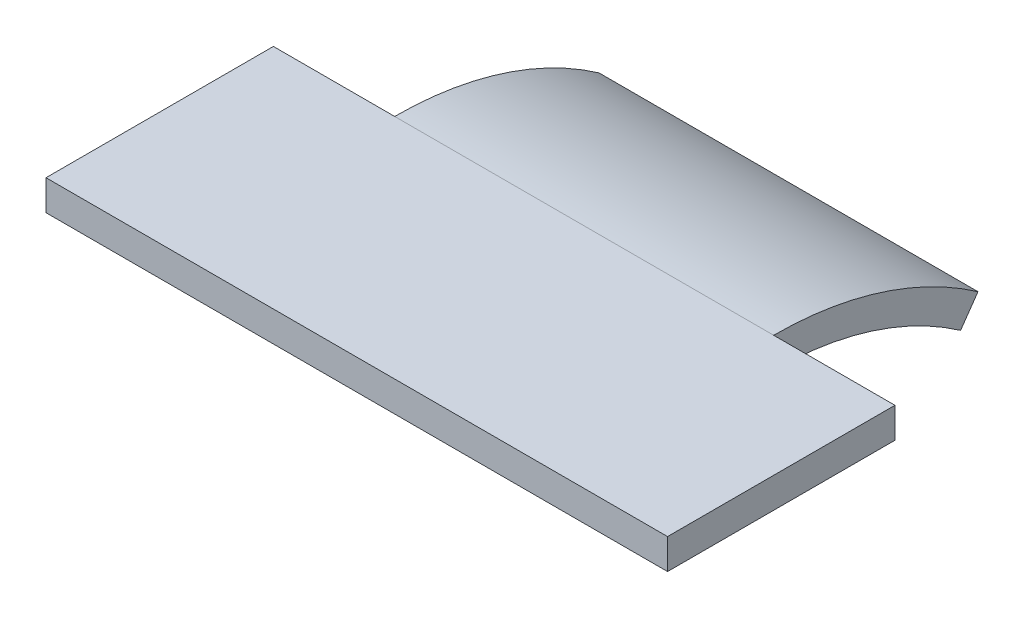
ISO-10303-21;
HEADER;
FILE_DESCRIPTION(('STEP AP214'),'2;1');
FILE_NAME('part.step','',(''),(''),'','','');
FILE_SCHEMA(('AUTOMOTIVE_DESIGN { 1 0 10303 214 1 1 1 1 }'));
ENDSEC;
DATA;
#1=APPLICATION_CONTEXT('core data for automotive mechanical design processes');
#2=APPLICATION_PROTOCOL_DEFINITION('international standard','automotive_design',2000,#1);
#3=PRODUCT_CONTEXT('',#1,'mechanical');
#4=PRODUCT('Part','Part','',(#3));
#5=PRODUCT_RELATED_PRODUCT_CATEGORY('part','',(#4));
#6=PRODUCT_DEFINITION_FORMATION('','',#4);
#7=PRODUCT_DEFINITION_CONTEXT('part definition',#1,'design');
#8=PRODUCT_DEFINITION('design','',#6,#7);
#9=PRODUCT_DEFINITION_SHAPE('','',#8);
#10=(LENGTH_UNIT() NAMED_UNIT(*) SI_UNIT(.MILLI.,.METRE.));
#11=(NAMED_UNIT(*) PLANE_ANGLE_UNIT() SI_UNIT($,.RADIAN.));
#12=(NAMED_UNIT(*) SI_UNIT($,.STERADIAN.) SOLID_ANGLE_UNIT());
#13=UNCERTAINTY_MEASURE_WITH_UNIT(LENGTH_MEASURE(1.E-05),#10,'distance_accuracy_value','');
#14=(GEOMETRIC_REPRESENTATION_CONTEXT(3) GLOBAL_UNCERTAINTY_ASSIGNED_CONTEXT((#13)) GLOBAL_UNIT_ASSIGNED_CONTEXT((#10,
#11,#12)) REPRESENTATION_CONTEXT('',''));
#15=CARTESIAN_POINT('',(0.,0.,0.));
#16=DIRECTION('',(0.,0.,1.));
#17=DIRECTION('',(1.,0.,0.));
#18=AXIS2_PLACEMENT_3D('',#15,#16,#17);
#19=CARTESIAN_POINT('',(82.,0.,0.));
#20=DIRECTION('',(-1.,0.,0.));
#21=DIRECTION('',(0.,0.,1.));
#22=AXIS2_PLACEMENT_3D('',#19,#20,#21);
#23=CYLINDRICAL_SURFACE('',#22,47.);
#24=DIRECTION('',(-1.,0.,0.));
#25=VECTOR('',#24,1.);
#26=CARTESIAN_POINT('',(82.,38.5001460815826,-26.9580925084992));
#27=LINE('',#26,#25);
#28=CARTESIAN_POINT('',(66.,38.5001460815826,-26.9580925084992));
#29=VERTEX_POINT('',#28);
#30=CARTESIAN_POINT('',(16.,38.5001460815826,-26.9580925084992));
#31=VERTEX_POINT('',#30);
#32=EDGE_CURVE('E158',#29,#31,#27,.T.);
#33=ORIENTED_EDGE('',*,*,#32,.T.);
#34=CARTESIAN_POINT('',(16.,0.,0.));
#35=DIRECTION('',(1.,0.,0.));
#36=DIRECTION('',(0.,0.,-1.));
#37=AXIS2_PLACEMENT_3D('',#34,#35,#36);
#38=CIRCLE('',#37,47.);
#39=CARTESIAN_POINT('',(16.,47.,0.));
#40=VERTEX_POINT('',#39);
#41=EDGE_CURVE('E143',#31,#40,#38,.T.);
#42=ORIENTED_EDGE('',*,*,#41,.T.);
#43=DIRECTION('',(-1.,0.,0.));
#44=VECTOR('',#43,1.);
#45=CARTESIAN_POINT('',(82.,47.,0.));
#46=LINE('',#45,#44);
#47=CARTESIAN_POINT('',(66.,47.,0.));
#48=VERTEX_POINT('',#47);
#49=EDGE_CURVE('E136',#48,#40,#46,.T.);
#50=ORIENTED_EDGE('',*,*,#49,.F.);
#51=CARTESIAN_POINT('',(66.,0.,0.));
#52=DIRECTION('',(-1.,0.,0.));
#53=DIRECTION('',(0.,0.,1.));
#54=AXIS2_PLACEMENT_3D('',#51,#52,#53);
#55=CIRCLE('',#54,47.);
#56=EDGE_CURVE('E196',#48,#29,#55,.T.);
#57=ORIENTED_EDGE('',*,*,#56,.T.);
#58=EDGE_LOOP('',(#33,#42,#50,#57));
#59=FACE_BOUND('',#58,.T.);
#60=ADVANCED_FACE('F43',(#59),#23,.T.);
#61=CARTESIAN_POINT('',(82.,47.,0.));
#62=DIRECTION('',(0.,-1.,0.));
#63=DIRECTION('',(0.,0.,-1.));
#64=AXIS2_PLACEMENT_3D('',#61,#62,#63);
#65=PLANE('',#64);
#66=DIRECTION('',(0.,0.,1.));
#67=VECTOR('',#66,1.);
#68=CARTESIAN_POINT('',(0.,47.,0.));
#69=LINE('',#68,#67);
#70=CARTESIAN_POINT('',(0.,47.,0.));
#71=VERTEX_POINT('',#70);
#72=CARTESIAN_POINT('',(0.,47.,30.));
#73=VERTEX_POINT('',#72);
#74=EDGE_CURVE('E134',#71,#73,#69,.T.);
#75=ORIENTED_EDGE('',*,*,#74,.T.);
#76=DIRECTION('',(-1.,0.,0.));
#77=VECTOR('',#76,1.);
#78=CARTESIAN_POINT('',(82.,47.,30.));
#79=LINE('',#78,#77);
#80=CARTESIAN_POINT('',(82.,47.,30.));
#81=VERTEX_POINT('',#80);
#82=EDGE_CURVE('E173',#81,#73,#79,.T.);
#83=ORIENTED_EDGE('',*,*,#82,.F.);
#84=DIRECTION('',(0.,0.,1.));
#85=VECTOR('',#84,1.);
#86=CARTESIAN_POINT('',(82.,47.,0.));
#87=LINE('',#86,#85);
#88=CARTESIAN_POINT('',(82.,47.,0.));
#89=VERTEX_POINT('',#88);
#90=EDGE_CURVE('E157',#89,#81,#87,.T.);
#91=ORIENTED_EDGE('',*,*,#90,.F.);
#92=EDGE_CURVE('E88',#89,#48,#46,.T.);
#93=ORIENTED_EDGE('',*,*,#92,.T.);
#94=ORIENTED_EDGE('',*,*,#49,.T.);
#95=DIRECTION('',(1.,0.,0.));
#96=VECTOR('',#95,1.);
#97=CARTESIAN_POINT('',(0.,47.,0.));
#98=LINE('',#97,#96);
#99=EDGE_CURVE('E121',#71,#40,#98,.T.);
#100=ORIENTED_EDGE('',*,*,#99,.F.);
#101=EDGE_LOOP('',(#75,#83,#91,#93,#94,#100));
#102=FACE_BOUND('',#101,.T.);
#103=ADVANCED_FACE('F132',(#102),#65,.F.);
#104=CARTESIAN_POINT('',(82.,47.,30.));
#105=DIRECTION('',(0.,0.,-1.));
#106=DIRECTION('',(-1.,0.,0.));
#107=AXIS2_PLACEMENT_3D('',#104,#105,#106);
#108=PLANE('',#107);
#109=DIRECTION('',(0.,-1.,0.));
#110=VECTOR('',#109,1.);
#111=CARTESIAN_POINT('',(0.,47.,30.));
#112=LINE('',#111,#110);
#113=CARTESIAN_POINT('',(0.,43.,30.));
#114=VERTEX_POINT('',#113);
#115=EDGE_CURVE('E74',#73,#114,#112,.T.);
#116=ORIENTED_EDGE('',*,*,#115,.T.);
#117=DIRECTION('',(-1.,0.,0.));
#118=VECTOR('',#117,1.);
#119=CARTESIAN_POINT('',(82.,43.,30.));
#120=LINE('',#119,#118);
#121=CARTESIAN_POINT('',(82.,43.,30.));
#122=VERTEX_POINT('',#121);
#123=EDGE_CURVE('E170',#122,#114,#120,.T.);
#124=ORIENTED_EDGE('',*,*,#123,.F.);
#125=DIRECTION('',(0.,-1.,0.));
#126=VECTOR('',#125,1.);
#127=CARTESIAN_POINT('',(82.,47.,30.));
#128=LINE('',#127,#126);
#129=EDGE_CURVE('E60',#81,#122,#128,.T.);
#130=ORIENTED_EDGE('',*,*,#129,.F.);
#131=ORIENTED_EDGE('',*,*,#82,.T.);
#132=EDGE_LOOP('',(#116,#124,#130,#131));
#133=FACE_BOUND('',#132,.T.);
#134=ADVANCED_FACE('F222',(#133),#108,.F.);
#135=CARTESIAN_POINT('',(82.,43.,0.));
#136=DIRECTION('',(0.,1.,0.));
#137=DIRECTION('',(0.,0.,1.));
#138=AXIS2_PLACEMENT_3D('',#135,#136,#137);
#139=PLANE('',#138);
#140=DIRECTION('',(0.,0.,-1.));
#141=VECTOR('',#140,1.);
#142=CARTESIAN_POINT('',(0.,43.,0.));
#143=LINE('',#142,#141);
#144=CARTESIAN_POINT('',(0.,43.,0.));
#145=VERTEX_POINT('',#144);
#146=EDGE_CURVE('E147',#114,#145,#143,.T.);
#147=ORIENTED_EDGE('',*,*,#146,.T.);
#148=DIRECTION('',(-1.,0.,0.));
#149=VECTOR('',#148,1.);
#150=CARTESIAN_POINT('',(82.,43.,0.));
#151=LINE('',#150,#149);
#152=CARTESIAN_POINT('',(16.,43.,0.));
#153=VERTEX_POINT('',#152);
#154=EDGE_CURVE('E81',#145,#153,#151,.F.);
#155=ORIENTED_EDGE('',*,*,#154,.T.);
#156=DIRECTION('',(-1.,0.,0.));
#157=VECTOR('',#156,1.);
#158=CARTESIAN_POINT('',(82.,43.,0.));
#159=LINE('',#158,#157);
#160=CARTESIAN_POINT('',(66.,43.,0.));
#161=VERTEX_POINT('',#160);
#162=EDGE_CURVE('E166',#161,#153,#159,.T.);
#163=ORIENTED_EDGE('',*,*,#162,.F.);
#164=CARTESIAN_POINT('',(82.,43.,0.));
#165=VERTEX_POINT('',#164);
#166=EDGE_CURVE('E167',#165,#161,#159,.T.);
#167=ORIENTED_EDGE('',*,*,#166,.F.);
#168=DIRECTION('',(0.,0.,-1.));
#169=VECTOR('',#168,1.);
#170=CARTESIAN_POINT('',(82.,43.,0.));
#171=LINE('',#170,#169);
#172=EDGE_CURVE('E152',#122,#165,#171,.T.);
#173=ORIENTED_EDGE('',*,*,#172,.F.);
#174=ORIENTED_EDGE('',*,*,#123,.T.);
#175=EDGE_LOOP('',(#147,#155,#163,#167,#173,#174));
#176=FACE_BOUND('',#175,.T.);
#177=ADVANCED_FACE('F210',(#176),#139,.F.);
#178=CARTESIAN_POINT('',(82.,0.,0.));
#179=DIRECTION('',(-1.,0.,0.));
#180=DIRECTION('',(0.,0.,1.));
#181=AXIS2_PLACEMENT_3D('',#178,#179,#180);
#182=CYLINDRICAL_SURFACE('',#181,43.);
#183=ORIENTED_EDGE('',*,*,#162,.T.);
#184=CARTESIAN_POINT('',(16.,0.,0.));
#185=DIRECTION('',(1.,0.,0.));
#186=DIRECTION('',(0.,0.,-1.));
#187=AXIS2_PLACEMENT_3D('',#184,#185,#186);
#188=CIRCLE('',#187,43.);
#189=CARTESIAN_POINT('',(16.,35.2235379044266,-24.663786763095));
#190=VERTEX_POINT('',#189);
#191=EDGE_CURVE('E149',#153,#190,#188,.F.);
#192=ORIENTED_EDGE('',*,*,#191,.T.);
#193=DIRECTION('',(-1.,0.,0.));
#194=VECTOR('',#193,1.);
#195=CARTESIAN_POINT('',(82.,35.2235379044266,-24.663786763095));
#196=LINE('',#195,#194);
#197=CARTESIAN_POINT('',(66.,35.2235379044266,-24.663786763095));
#198=VERTEX_POINT('',#197);
#199=EDGE_CURVE('E162',#198,#190,#196,.T.);
#200=ORIENTED_EDGE('',*,*,#199,.F.);
#201=CARTESIAN_POINT('',(66.,0.,0.));
#202=DIRECTION('',(-1.,0.,0.));
#203=DIRECTION('',(0.,0.,1.));
#204=AXIS2_PLACEMENT_3D('',#201,#202,#203);
#205=CIRCLE('',#204,43.);
#206=EDGE_CURVE('E192',#198,#161,#205,.F.);
#207=ORIENTED_EDGE('',*,*,#206,.T.);
#208=EDGE_LOOP('',(#183,#192,#200,#207));
#209=FACE_BOUND('',#208,.T.);
#210=ADVANCED_FACE('F191',(#209),#182,.F.);
#211=CARTESIAN_POINT('',(82.,35.2235379044266,-24.663786763095));
#212=DIRECTION('',(0.,0.573576436351048,0.81915204428899));
#213=DIRECTION('',(0.,-0.81915204428899,0.573576436351048));
#214=AXIS2_PLACEMENT_3D('',#211,#212,#213);
#215=PLANE('',#214);
#216=ORIENTED_EDGE('',*,*,#199,.T.);
#217=DIRECTION('',(0.,0.81915204428899,-0.573576436351048));
#218=VECTOR('',#217,1.);
#219=CARTESIAN_POINT('',(16.,35.2235379044266,-24.663786763095));
#220=LINE('',#219,#218);
#221=EDGE_CURVE('E11',#190,#31,#220,.T.);
#222=ORIENTED_EDGE('',*,*,#221,.T.);
#223=ORIENTED_EDGE('',*,*,#32,.F.);
#224=DIRECTION('',(0.,-0.81915204428899,0.573576436351048));
#225=VECTOR('',#224,1.);
#226=CARTESIAN_POINT('',(66.,35.2235379044266,-24.663786763095));
#227=LINE('',#226,#225);
#228=EDGE_CURVE('E52',#29,#198,#227,.T.);
#229=ORIENTED_EDGE('',*,*,#228,.T.);
#230=EDGE_LOOP('',(#216,#222,#223,#229));
#231=FACE_BOUND('',#230,.T.);
#232=ADVANCED_FACE('F184',(#231),#215,.F.);
#233=CARTESIAN_POINT('',(82.,0.,0.));
#234=DIRECTION('',(1.,0.,0.));
#235=DIRECTION('',(0.,0.,-1.));
#236=AXIS2_PLACEMENT_3D('',#233,#234,#235);
#237=PLANE('',#236);
#238=DIRECTION('',(0.,-1.,0.));
#239=VECTOR('',#238,1.);
#240=CARTESIAN_POINT('',(82.,0.,0.));
#241=LINE('',#240,#239);
#242=EDGE_CURVE('E128',#89,#165,#241,.T.);
#243=ORIENTED_EDGE('',*,*,#242,.F.);
#244=ORIENTED_EDGE('',*,*,#90,.T.);
#245=ORIENTED_EDGE('',*,*,#129,.T.);
#246=ORIENTED_EDGE('',*,*,#172,.T.);
#247=EDGE_LOOP('',(#243,#244,#245,#246));
#248=FACE_BOUND('',#247,.T.);
#249=ADVANCED_FACE('F207',(#248),#237,.T.);
#250=CARTESIAN_POINT('',(0.,0.,0.));
#251=DIRECTION('',(1.,0.,0.));
#252=DIRECTION('',(0.,0.,-1.));
#253=AXIS2_PLACEMENT_3D('',#250,#251,#252);
#254=PLANE('',#253);
#255=ORIENTED_EDGE('',*,*,#74,.F.);
#256=DIRECTION('',(0.,-1.,0.));
#257=VECTOR('',#256,1.);
#258=CARTESIAN_POINT('',(0.,0.,0.));
#259=LINE('',#258,#257);
#260=EDGE_CURVE('E118',#71,#145,#259,.T.);
#261=ORIENTED_EDGE('',*,*,#260,.T.);
#262=ORIENTED_EDGE('',*,*,#146,.F.);
#263=ORIENTED_EDGE('',*,*,#115,.F.);
#264=EDGE_LOOP('',(#255,#261,#262,#263));
#265=FACE_BOUND('',#264,.T.);
#266=ADVANCED_FACE('F141',(#265),#254,.F.);
#267=CARTESIAN_POINT('',(16.,27.,0.));
#268=DIRECTION('',(1.,0.,0.));
#269=DIRECTION('',(0.,0.,-1.));
#270=AXIS2_PLACEMENT_3D('',#267,#268,#269);
#271=PLANE('',#270);
#272=ORIENTED_EDGE('',*,*,#221,.F.);
#273=ORIENTED_EDGE('',*,*,#191,.F.);
#274=DIRECTION('',(0.,1.,0.));
#275=VECTOR('',#274,1.);
#276=CARTESIAN_POINT('',(16.,27.,0.));
#277=LINE('',#276,#275);
#278=EDGE_CURVE('E138',#153,#40,#277,.T.);
#279=ORIENTED_EDGE('',*,*,#278,.T.);
#280=ORIENTED_EDGE('',*,*,#41,.F.);
#281=EDGE_LOOP('',(#272,#273,#279,#280));
#282=FACE_BOUND('',#281,.T.);
#283=ADVANCED_FACE('F221',(#282),#271,.F.);
#284=CARTESIAN_POINT('',(0.,27.,0.));
#285=DIRECTION('',(0.,0.,1.));
#286=DIRECTION('',(0.,-1.,0.));
#287=AXIS2_PLACEMENT_3D('',#284,#285,#286);
#288=PLANE('',#287);
#289=ORIENTED_EDGE('',*,*,#260,.F.);
#290=ORIENTED_EDGE('',*,*,#99,.T.);
#291=ORIENTED_EDGE('',*,*,#278,.F.);
#292=ORIENTED_EDGE('',*,*,#154,.F.);
#293=EDGE_LOOP('',(#289,#290,#291,#292));
#294=FACE_BOUND('',#293,.T.);
#295=ADVANCED_FACE('F120',(#294),#288,.F.);
#296=CARTESIAN_POINT('',(66.,27.,0.));
#297=DIRECTION('',(-1.,0.,0.));
#298=DIRECTION('',(0.,0.,1.));
#299=AXIS2_PLACEMENT_3D('',#296,#297,#298);
#300=PLANE('',#299);
#301=DIRECTION('',(0.,1.,0.));
#302=VECTOR('',#301,1.);
#303=CARTESIAN_POINT('',(66.,27.,0.));
#304=LINE('',#303,#302);
#305=EDGE_CURVE('E139',#161,#48,#304,.T.);
#306=ORIENTED_EDGE('',*,*,#305,.F.);
#307=ORIENTED_EDGE('',*,*,#206,.F.);
#308=ORIENTED_EDGE('',*,*,#228,.F.);
#309=ORIENTED_EDGE('',*,*,#56,.F.);
#310=EDGE_LOOP('',(#306,#307,#308,#309));
#311=FACE_BOUND('',#310,.T.);
#312=ADVANCED_FACE('F213',(#311),#300,.F.);
#313=CARTESIAN_POINT('',(66.,27.,0.));
#314=DIRECTION('',(0.,0.,1.));
#315=DIRECTION('',(0.,-1.,0.));
#316=AXIS2_PLACEMENT_3D('',#313,#314,#315);
#317=PLANE('',#316);
#318=ORIENTED_EDGE('',*,*,#305,.T.);
#319=ORIENTED_EDGE('',*,*,#92,.F.);
#320=ORIENTED_EDGE('',*,*,#242,.T.);
#321=ORIENTED_EDGE('',*,*,#166,.T.);
#322=EDGE_LOOP('',(#318,#319,#320,#321));
#323=FACE_BOUND('',#322,.T.);
#324=ADVANCED_FACE('F212',(#323),#317,.F.);
#325=CLOSED_SHELL('',(#60,#103,#134,#177,#210,#232,#249,#266,#283,#295,#312,#324));
#326=MANIFOLD_SOLID_BREP('B2',#325);
#327=ADVANCED_BREP_SHAPE_REPRESENTATION('',(#18,#326),#14);
#328=SHAPE_DEFINITION_REPRESENTATION(#9,#327);
ENDSEC;
END-ISO-10303-21;
